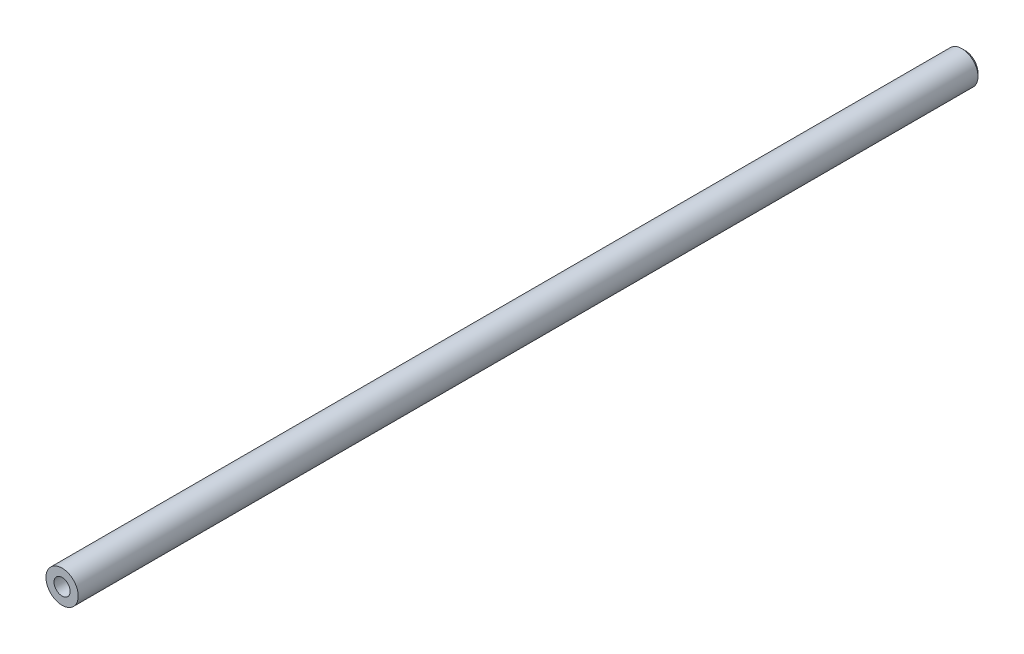
ISO-10303-21;
HEADER;
FILE_DESCRIPTION(('STEP AP214'),'2;1');
FILE_NAME('part.step','',(''),(''),'','','');
FILE_SCHEMA(('AUTOMOTIVE_DESIGN { 1 0 10303 214 1 1 1 1 }'));
ENDSEC;
DATA;
#1=APPLICATION_CONTEXT('core data for automotive mechanical design processes');
#2=APPLICATION_PROTOCOL_DEFINITION('international standard','automotive_design',2000,#1);
#3=PRODUCT_CONTEXT('',#1,'mechanical');
#4=PRODUCT('Part','Part','',(#3));
#5=PRODUCT_RELATED_PRODUCT_CATEGORY('part','',(#4));
#6=PRODUCT_DEFINITION_FORMATION('','',#4);
#7=PRODUCT_DEFINITION_CONTEXT('part definition',#1,'design');
#8=PRODUCT_DEFINITION('design','',#6,#7);
#9=PRODUCT_DEFINITION_SHAPE('','',#8);
#10=(LENGTH_UNIT() NAMED_UNIT(*) SI_UNIT(.MILLI.,.METRE.));
#11=(NAMED_UNIT(*) PLANE_ANGLE_UNIT() SI_UNIT($,.RADIAN.));
#12=(NAMED_UNIT(*) SI_UNIT($,.STERADIAN.) SOLID_ANGLE_UNIT());
#13=UNCERTAINTY_MEASURE_WITH_UNIT(LENGTH_MEASURE(1.E-05),#10,'distance_accuracy_value','');
#14=(GEOMETRIC_REPRESENTATION_CONTEXT(3) GLOBAL_UNCERTAINTY_ASSIGNED_CONTEXT((#13)) GLOBAL_UNIT_ASSIGNED_CONTEXT((#10,
#11,#12)) REPRESENTATION_CONTEXT('',''));
#15=CARTESIAN_POINT('',(0.,0.,0.));
#16=DIRECTION('',(0.,0.,1.));
#17=DIRECTION('',(1.,0.,0.));
#18=AXIS2_PLACEMENT_3D('',#15,#16,#17);
#19=CARTESIAN_POINT('',(0.,0.,140.));
#20=DIRECTION('',(0.,0.,-1.));
#21=DIRECTION('',(-1.,0.,0.));
#22=AXIS2_PLACEMENT_3D('',#19,#20,#21);
#23=CYLINDRICAL_SURFACE('',#22,5.);
#24=CARTESIAN_POINT('',(0.,0.,-139.));
#25=DIRECTION('',(0.,0.,1.));
#26=DIRECTION('',(1.,0.,0.));
#27=AXIS2_PLACEMENT_3D('',#24,#25,#26);
#28=CIRCLE('',#27,5.);
#29=CARTESIAN_POINT('',(5.,0.,-139.));
#30=VERTEX_POINT('',#29);
#31=EDGE_CURVE('E47',#30,#30,#28,.T.);
#32=ORIENTED_EDGE('',*,*,#31,.T.);
#33=EDGE_LOOP('',(#32));
#34=FACE_BOUND('',#33,.T.);
#35=CARTESIAN_POINT('',(0.,0.,140.));
#36=DIRECTION('',(0.,0.,1.));
#37=DIRECTION('',(1.,0.,0.));
#38=AXIS2_PLACEMENT_3D('',#35,#36,#37);
#39=CIRCLE('',#38,5.);
#40=CARTESIAN_POINT('',(5.,0.,140.));
#41=VERTEX_POINT('',#40);
#42=EDGE_CURVE('E74',#41,#41,#39,.T.);
#43=ORIENTED_EDGE('',*,*,#42,.F.);
#44=EDGE_LOOP('',(#43));
#45=FACE_BOUND('',#44,.T.);
#46=ADVANCED_FACE('F39',(#34,#45),#23,.T.);
#47=CARTESIAN_POINT('',(0.,0.,140.));
#48=DIRECTION('',(0.,0.,1.));
#49=DIRECTION('',(1.,0.,0.));
#50=AXIS2_PLACEMENT_3D('',#47,#48,#49);
#51=PLANE('',#50);
#52=CARTESIAN_POINT('',(0.,0.,140.));
#53=DIRECTION('',(0.,0.,1.));
#54=DIRECTION('',(1.,0.,0.));
#55=AXIS2_PLACEMENT_3D('',#52,#53,#54);
#56=CIRCLE('',#55,2.5);
#57=CARTESIAN_POINT('',(2.5,0.,140.));
#58=VERTEX_POINT('',#57);
#59=EDGE_CURVE('E63',#58,#58,#56,.T.);
#60=ORIENTED_EDGE('',*,*,#59,.F.);
#61=EDGE_LOOP('',(#60));
#62=FACE_BOUND('',#61,.T.);
#63=ORIENTED_EDGE('',*,*,#42,.T.);
#64=EDGE_LOOP('',(#63));
#65=FACE_BOUND('',#64,.T.);
#66=ADVANCED_FACE('F89',(#62,#65),#51,.T.);
#67=CARTESIAN_POINT('',(0.,0.,-140.));
#68=DIRECTION('',(0.,0.,1.));
#69=DIRECTION('',(1.,0.,0.));
#70=AXIS2_PLACEMENT_3D('',#67,#68,#69);
#71=PLANE('',#70);
#72=CARTESIAN_POINT('',(0.,0.,-140.));
#73=DIRECTION('',(0.,0.,1.));
#74=DIRECTION('',(1.,0.,0.));
#75=AXIS2_PLACEMENT_3D('',#72,#73,#74);
#76=CIRCLE('',#75,4.);
#77=CARTESIAN_POINT('',(4.,0.,-140.));
#78=VERTEX_POINT('',#77);
#79=EDGE_CURVE('E11',#78,#78,#76,.F.);
#80=ORIENTED_EDGE('',*,*,#79,.T.);
#81=EDGE_LOOP('',(#80));
#82=FACE_BOUND('',#81,.T.);
#83=CARTESIAN_POINT('',(0.,0.,-140.));
#84=DIRECTION('',(0.,0.,-1.));
#85=DIRECTION('',(-1.,0.,0.));
#86=AXIS2_PLACEMENT_3D('',#83,#84,#85);
#87=CIRCLE('',#86,2.5);
#88=CARTESIAN_POINT('',(-2.5,0.,-140.));
#89=VERTEX_POINT('',#88);
#90=EDGE_CURVE('E64',#89,#89,#87,.T.);
#91=ORIENTED_EDGE('',*,*,#90,.F.);
#92=EDGE_LOOP('',(#91));
#93=FACE_BOUND('',#92,.T.);
#94=ADVANCED_FACE('F93',(#82,#93),#71,.F.);
#95=CARTESIAN_POINT('',(0.,0.,123.));
#96=DIRECTION('',(0.,0.,1.));
#97=DIRECTION('',(1.,0.,0.));
#98=AXIS2_PLACEMENT_3D('',#95,#96,#97);
#99=CONICAL_SURFACE('',#98,2.5,1.02974425867665);
#100=CARTESIAN_POINT('',(0.,0.,121.497848452431));
#101=VERTEX_POINT('',#100);
#102=VERTEX_LOOP('',#101);
#103=FACE_BOUND('',#102,.T.);
#104=CARTESIAN_POINT('',(0.,0.,123.));
#105=DIRECTION('',(0.,0.,1.));
#106=DIRECTION('',(1.,0.,0.));
#107=AXIS2_PLACEMENT_3D('',#104,#105,#106);
#108=CIRCLE('',#107,2.5);
#109=CARTESIAN_POINT('',(2.5,0.,123.));
#110=VERTEX_POINT('',#109);
#111=EDGE_CURVE('E67',#110,#110,#108,.T.);
#112=ORIENTED_EDGE('',*,*,#111,.T.);
#113=EDGE_LOOP('',(#112));
#114=FACE_BOUND('',#113,.T.);
#115=ADVANCED_FACE('F98',(#103,#114),#99,.F.);
#116=CARTESIAN_POINT('',(0.,0.,140.));
#117=DIRECTION('',(0.,0.,1.));
#118=DIRECTION('',(1.,0.,0.));
#119=AXIS2_PLACEMENT_3D('',#116,#117,#118);
#120=CYLINDRICAL_SURFACE('',#119,2.5);
#121=ORIENTED_EDGE('',*,*,#111,.F.);
#122=EDGE_LOOP('',(#121));
#123=FACE_BOUND('',#122,.T.);
#124=ORIENTED_EDGE('',*,*,#59,.T.);
#125=EDGE_LOOP('',(#124));
#126=FACE_BOUND('',#125,.T.);
#127=ADVANCED_FACE('F57',(#123,#126),#120,.F.);
#128=CARTESIAN_POINT('',(0.,0.,-123.));
#129=DIRECTION('',(0.,0.,-1.));
#130=DIRECTION('',(-1.,0.,0.));
#131=AXIS2_PLACEMENT_3D('',#128,#129,#130);
#132=CONICAL_SURFACE('',#131,2.5,1.02974425867665);
#133=CARTESIAN_POINT('',(0.,0.,-121.497848452431));
#134=VERTEX_POINT('',#133);
#135=VERTEX_LOOP('',#134);
#136=FACE_BOUND('',#135,.T.);
#137=CARTESIAN_POINT('',(0.,0.,-123.));
#138=DIRECTION('',(0.,0.,-1.));
#139=DIRECTION('',(-1.,0.,0.));
#140=AXIS2_PLACEMENT_3D('',#137,#138,#139);
#141=CIRCLE('',#140,2.5);
#142=CARTESIAN_POINT('',(-2.5,0.,-123.));
#143=VERTEX_POINT('',#142);
#144=EDGE_CURVE('E61',#143,#143,#141,.T.);
#145=ORIENTED_EDGE('',*,*,#144,.T.);
#146=EDGE_LOOP('',(#145));
#147=FACE_BOUND('',#146,.T.);
#148=ADVANCED_FACE('F53',(#136,#147),#132,.F.);
#149=CARTESIAN_POINT('',(0.,0.,-140.));
#150=DIRECTION('',(0.,0.,-1.));
#151=DIRECTION('',(-1.,0.,0.));
#152=AXIS2_PLACEMENT_3D('',#149,#150,#151);
#153=CYLINDRICAL_SURFACE('',#152,2.5);
#154=ORIENTED_EDGE('',*,*,#144,.F.);
#155=EDGE_LOOP('',(#154));
#156=FACE_BOUND('',#155,.T.);
#157=ORIENTED_EDGE('',*,*,#90,.T.);
#158=EDGE_LOOP('',(#157));
#159=FACE_BOUND('',#158,.T.);
#160=ADVANCED_FACE('F56',(#156,#159),#153,.F.);
#161=CARTESIAN_POINT('',(0.,0.,-139.));
#162=DIRECTION('',(0.,0.,1.));
#163=DIRECTION('',(1.,0.,0.));
#164=AXIS2_PLACEMENT_3D('',#161,#162,#163);
#165=CONICAL_SURFACE('',#164,5.,0.785398163397446);
#166=ORIENTED_EDGE('',*,*,#79,.F.);
#167=EDGE_LOOP('',(#166));
#168=FACE_BOUND('',#167,.T.);
#169=ORIENTED_EDGE('',*,*,#31,.F.);
#170=EDGE_LOOP('',(#169));
#171=FACE_BOUND('',#170,.T.);
#172=ADVANCED_FACE('F41',(#168,#171),#165,.T.);
#173=CLOSED_SHELL('',(#46,#66,#94,#115,#127,#148,#160,#172));
#174=MANIFOLD_SOLID_BREP('B2',#173);
#175=ADVANCED_BREP_SHAPE_REPRESENTATION('',(#18,#174),#14);
#176=SHAPE_DEFINITION_REPRESENTATION(#9,#175);
ENDSEC;
END-ISO-10303-21;
